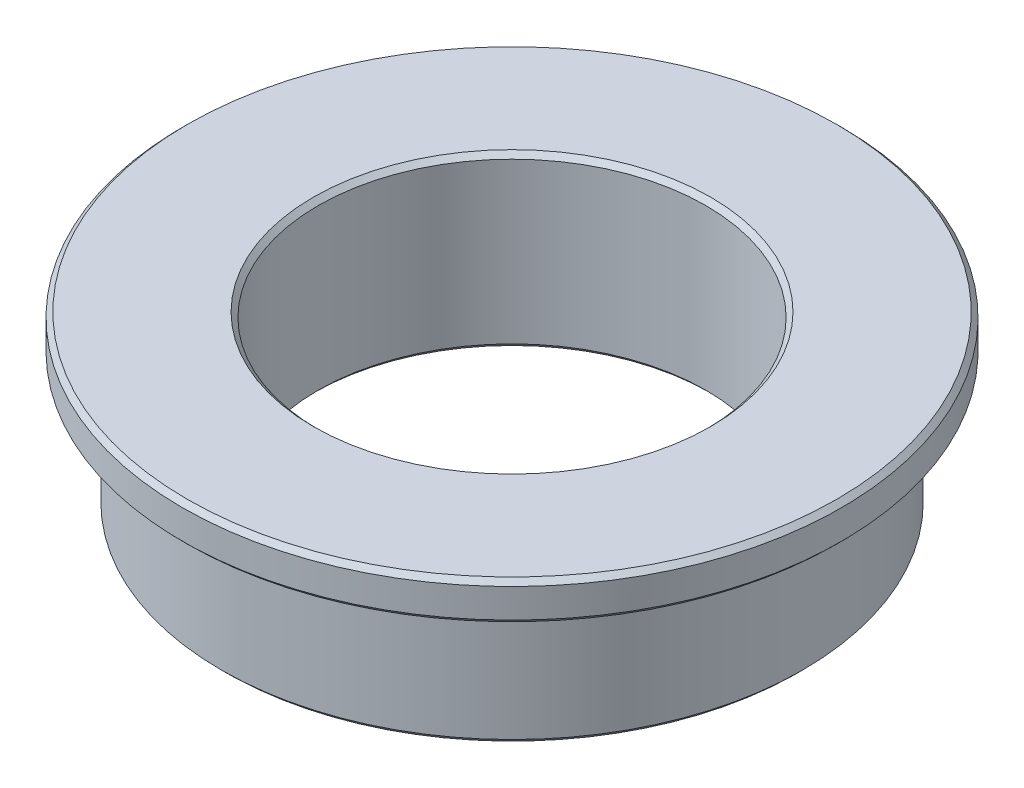
ISO-10303-21;
HEADER;
FILE_DESCRIPTION(('STEP AP214'),'2;1');
FILE_NAME('part.step','',(''),(''),'','','');
FILE_SCHEMA(('AUTOMOTIVE_DESIGN { 1 0 10303 214 1 1 1 1 }'));
ENDSEC;
DATA;
#1=APPLICATION_CONTEXT('core data for automotive mechanical design processes');
#2=APPLICATION_PROTOCOL_DEFINITION('international standard','automotive_design',2000,#1);
#3=PRODUCT_CONTEXT('',#1,'mechanical');
#4=PRODUCT('Part','Part','',(#3));
#5=PRODUCT_RELATED_PRODUCT_CATEGORY('part','',(#4));
#6=PRODUCT_DEFINITION_FORMATION('','',#4);
#7=PRODUCT_DEFINITION_CONTEXT('part definition',#1,'design');
#8=PRODUCT_DEFINITION('design','',#6,#7);
#9=PRODUCT_DEFINITION_SHAPE('','',#8);
#10=(LENGTH_UNIT() NAMED_UNIT(*) SI_UNIT(.MILLI.,.METRE.));
#11=(NAMED_UNIT(*) PLANE_ANGLE_UNIT() SI_UNIT($,.RADIAN.));
#12=(NAMED_UNIT(*) SI_UNIT($,.STERADIAN.) SOLID_ANGLE_UNIT());
#13=UNCERTAINTY_MEASURE_WITH_UNIT(LENGTH_MEASURE(1.E-05),#10,'distance_accuracy_value','');
#14=(GEOMETRIC_REPRESENTATION_CONTEXT(3) GLOBAL_UNCERTAINTY_ASSIGNED_CONTEXT((#13)) GLOBAL_UNIT_ASSIGNED_CONTEXT((#10,
#11,#12)) REPRESENTATION_CONTEXT('',''));
#15=CARTESIAN_POINT('',(0.,0.,0.));
#16=DIRECTION('',(0.,0.,1.));
#17=DIRECTION('',(1.,0.,0.));
#18=AXIS2_PLACEMENT_3D('',#15,#16,#17);
#19=CARTESIAN_POINT('',(4.,0.,0.));
#20=DIRECTION('',(0.,-1.,0.));
#21=DIRECTION('',(0.,0.,-1.));
#22=AXIS2_PLACEMENT_3D('',#19,#20,#21);
#23=PLANE('',#22);
#24=CARTESIAN_POINT('',(0.,0.,0.));
#25=DIRECTION('',(0.,-1.,0.));
#26=DIRECTION('',(0.,0.,-1.));
#27=AXIS2_PLACEMENT_3D('',#24,#25,#26);
#28=CIRCLE('',#27,5.9);
#29=CARTESIAN_POINT('',(0.,0.,-5.9));
#30=VERTEX_POINT('',#29);
#31=EDGE_CURVE('E72',#30,#30,#28,.T.);
#32=ORIENTED_EDGE('',*,*,#31,.T.);
#33=EDGE_LOOP('',(#32));
#34=FACE_BOUND('',#33,.T.);
#35=CARTESIAN_POINT('',(0.,0.,0.));
#36=DIRECTION('',(0.,-1.,0.));
#37=DIRECTION('',(0.,0.,-1.));
#38=AXIS2_PLACEMENT_3D('',#35,#36,#37);
#39=CIRCLE('',#38,4.1);
#40=CARTESIAN_POINT('',(0.,0.,-4.1));
#41=VERTEX_POINT('',#40);
#42=EDGE_CURVE('E75',#41,#41,#39,.F.);
#43=ORIENTED_EDGE('',*,*,#42,.T.);
#44=EDGE_LOOP('',(#43));
#45=FACE_BOUND('',#44,.T.);
#46=ADVANCED_FACE('F39',(#34,#45),#23,.T.);
#47=CARTESIAN_POINT('',(0.,0.,0.));
#48=DIRECTION('',(0.,-1.,0.));
#49=DIRECTION('',(0.,0.,-1.));
#50=AXIS2_PLACEMENT_3D('',#47,#48,#49);
#51=CYLINDRICAL_SURFACE('',#50,6.);
#52=CARTESIAN_POINT('',(0.,0.1,0.));
#53=DIRECTION('',(0.,-1.,0.));
#54=DIRECTION('',(0.,0.,-1.));
#55=AXIS2_PLACEMENT_3D('',#52,#53,#54);
#56=CIRCLE('',#55,6.);
#57=CARTESIAN_POINT('',(0.,0.1,-6.));
#58=VERTEX_POINT('',#57);
#59=EDGE_CURVE('E69',#58,#58,#56,.F.);
#60=ORIENTED_EDGE('',*,*,#59,.T.);
#61=EDGE_LOOP('',(#60));
#62=FACE_BOUND('',#61,.T.);
#63=CARTESIAN_POINT('',(0.,2.7,0.));
#64=DIRECTION('',(0.,-1.,0.));
#65=DIRECTION('',(0.,0.,-1.));
#66=AXIS2_PLACEMENT_3D('',#63,#64,#65);
#67=CIRCLE('',#66,6.);
#68=CARTESIAN_POINT('',(0.,2.7,-6.));
#69=VERTEX_POINT('',#68);
#70=EDGE_CURVE('E78',#69,#69,#67,.T.);
#71=ORIENTED_EDGE('',*,*,#70,.T.);
#72=EDGE_LOOP('',(#71));
#73=FACE_BOUND('',#72,.T.);
#74=ADVANCED_FACE('F82',(#62,#73),#51,.T.);
#75=CARTESIAN_POINT('',(6.,2.7,0.));
#76=DIRECTION('',(0.,-1.,0.));
#77=DIRECTION('',(0.,0.,-1.));
#78=AXIS2_PLACEMENT_3D('',#75,#76,#77);
#79=PLANE('',#78);
#80=CARTESIAN_POINT('',(0.,2.7,0.));
#81=DIRECTION('',(0.,-1.,0.));
#82=DIRECTION('',(0.,0.,-1.));
#83=AXIS2_PLACEMENT_3D('',#80,#81,#82);
#84=CIRCLE('',#83,6.7);
#85=CARTESIAN_POINT('',(0.,2.7,-6.7));
#86=VERTEX_POINT('',#85);
#87=EDGE_CURVE('E60',#86,#86,#84,.T.);
#88=ORIENTED_EDGE('',*,*,#87,.T.);
#89=EDGE_LOOP('',(#88));
#90=FACE_BOUND('',#89,.T.);
#91=ORIENTED_EDGE('',*,*,#70,.F.);
#92=EDGE_LOOP('',(#91));
#93=FACE_BOUND('',#92,.T.);
#94=ADVANCED_FACE('F84',(#90,#93),#79,.T.);
#95=CARTESIAN_POINT('',(0.,0.,0.));
#96=DIRECTION('',(0.,-1.,0.));
#97=DIRECTION('',(0.,0.,-1.));
#98=AXIS2_PLACEMENT_3D('',#95,#96,#97);
#99=CYLINDRICAL_SURFACE('',#98,6.8);
#100=CARTESIAN_POINT('',(0.,2.8,0.));
#101=DIRECTION('',(0.,-1.,0.));
#102=DIRECTION('',(0.,0.,-1.));
#103=AXIS2_PLACEMENT_3D('',#100,#101,#102);
#104=CIRCLE('',#103,6.8);
#105=CARTESIAN_POINT('',(0.,2.8,-6.8));
#106=VERTEX_POINT('',#105);
#107=EDGE_CURVE('E51',#106,#106,#104,.F.);
#108=ORIENTED_EDGE('',*,*,#107,.T.);
#109=EDGE_LOOP('',(#108));
#110=FACE_BOUND('',#109,.T.);
#111=CARTESIAN_POINT('',(0.,3.4,0.));
#112=DIRECTION('',(0.,1.,0.));
#113=DIRECTION('',(0.,0.,1.));
#114=AXIS2_PLACEMENT_3D('',#111,#112,#113);
#115=CIRCLE('',#114,6.8);
#116=CARTESIAN_POINT('',(0.,3.4,6.8));
#117=VERTEX_POINT('',#116);
#118=EDGE_CURVE('E55',#117,#117,#115,.F.);
#119=ORIENTED_EDGE('',*,*,#118,.T.);
#120=EDGE_LOOP('',(#119));
#121=FACE_BOUND('',#120,.T.);
#122=ADVANCED_FACE('F86',(#110,#121),#99,.T.);
#123=CARTESIAN_POINT('',(6.8,3.5,0.));
#124=DIRECTION('',(0.,1.,0.));
#125=DIRECTION('',(0.,0.,1.));
#126=AXIS2_PLACEMENT_3D('',#123,#124,#125);
#127=PLANE('',#126);
#128=CARTESIAN_POINT('',(0.,3.5,0.));
#129=DIRECTION('',(0.,1.,0.));
#130=DIRECTION('',(0.,0.,1.));
#131=AXIS2_PLACEMENT_3D('',#128,#129,#130);
#132=CIRCLE('',#131,6.7);
#133=CARTESIAN_POINT('',(0.,3.5,6.7));
#134=VERTEX_POINT('',#133);
#135=EDGE_CURVE('E10',#134,#134,#132,.T.);
#136=ORIENTED_EDGE('',*,*,#135,.T.);
#137=EDGE_LOOP('',(#136));
#138=FACE_BOUND('',#137,.T.);
#139=CARTESIAN_POINT('',(0.,3.5,0.));
#140=DIRECTION('',(0.,1.,0.));
#141=DIRECTION('',(0.,0.,1.));
#142=AXIS2_PLACEMENT_3D('',#139,#140,#141);
#143=CIRCLE('',#142,4.1);
#144=CARTESIAN_POINT('',(0.,3.5,4.1));
#145=VERTEX_POINT('',#144);
#146=EDGE_CURVE('E47',#145,#145,#143,.F.);
#147=ORIENTED_EDGE('',*,*,#146,.T.);
#148=EDGE_LOOP('',(#147));
#149=FACE_BOUND('',#148,.T.);
#150=ADVANCED_FACE('F93',(#138,#149),#127,.T.);
#151=CARTESIAN_POINT('',(0.,0.,0.));
#152=DIRECTION('',(0.,-1.,0.));
#153=DIRECTION('',(0.,0.,-1.));
#154=AXIS2_PLACEMENT_3D('',#151,#152,#153);
#155=CYLINDRICAL_SURFACE('',#154,4.);
#156=CARTESIAN_POINT('',(0.,0.100000000000002,0.));
#157=DIRECTION('',(0.,-1.,0.));
#158=DIRECTION('',(0.,0.,-1.));
#159=AXIS2_PLACEMENT_3D('',#156,#157,#158);
#160=CIRCLE('',#159,4.);
#161=CARTESIAN_POINT('',(0.,0.100000000000002,-4.));
#162=VERTEX_POINT('',#161);
#163=EDGE_CURVE('E63',#162,#162,#160,.T.);
#164=ORIENTED_EDGE('',*,*,#163,.T.);
#165=EDGE_LOOP('',(#164));
#166=FACE_BOUND('',#165,.T.);
#167=CARTESIAN_POINT('',(0.,3.4,0.));
#168=DIRECTION('',(0.,1.,0.));
#169=DIRECTION('',(0.,0.,1.));
#170=AXIS2_PLACEMENT_3D('',#167,#168,#169);
#171=CIRCLE('',#170,4.);
#172=CARTESIAN_POINT('',(0.,3.4,4.));
#173=VERTEX_POINT('',#172);
#174=EDGE_CURVE('E66',#173,#173,#171,.T.);
#175=ORIENTED_EDGE('',*,*,#174,.T.);
#176=EDGE_LOOP('',(#175));
#177=FACE_BOUND('',#176,.T.);
#178=ADVANCED_FACE('F113',(#166,#177),#155,.F.);
#179=CARTESIAN_POINT('',(0.,0.,0.));
#180=DIRECTION('',(0.,1.,0.));
#181=DIRECTION('',(0.,0.,1.));
#182=AXIS2_PLACEMENT_3D('',#179,#180,#181);
#183=CONICAL_SURFACE('',#182,5.9,0.785398163397435);
#184=ORIENTED_EDGE('',*,*,#59,.F.);
#185=EDGE_LOOP('',(#184));
#186=FACE_BOUND('',#185,.T.);
#187=ORIENTED_EDGE('',*,*,#31,.F.);
#188=EDGE_LOOP('',(#187));
#189=FACE_BOUND('',#188,.T.);
#190=ADVANCED_FACE('F106',(#186,#189),#183,.T.);
#191=CARTESIAN_POINT('',(0.,0.100000000000002,0.));
#192=DIRECTION('',(0.,-1.,0.));
#193=DIRECTION('',(0.,0.,-1.));
#194=AXIS2_PLACEMENT_3D('',#191,#192,#193);
#195=CONICAL_SURFACE('',#194,4.,0.785398163397448);
#196=ORIENTED_EDGE('',*,*,#42,.F.);
#197=EDGE_LOOP('',(#196));
#198=FACE_BOUND('',#197,.T.);
#199=ORIENTED_EDGE('',*,*,#163,.F.);
#200=EDGE_LOOP('',(#199));
#201=FACE_BOUND('',#200,.T.);
#202=ADVANCED_FACE('F112',(#198,#201),#195,.F.);
#203=CARTESIAN_POINT('',(0.,2.7,0.));
#204=DIRECTION('',(0.,1.,0.));
#205=DIRECTION('',(0.,0.,1.));
#206=AXIS2_PLACEMENT_3D('',#203,#204,#205);
#207=CONICAL_SURFACE('',#206,6.7,0.785398163397453);
#208=ORIENTED_EDGE('',*,*,#107,.F.);
#209=EDGE_LOOP('',(#208));
#210=FACE_BOUND('',#209,.T.);
#211=ORIENTED_EDGE('',*,*,#87,.F.);
#212=EDGE_LOOP('',(#211));
#213=FACE_BOUND('',#212,.T.);
#214=ADVANCED_FACE('F120',(#210,#213),#207,.T.);
#215=CARTESIAN_POINT('',(0.,3.4,0.));
#216=DIRECTION('',(0.,-1.,0.));
#217=DIRECTION('',(0.,0.,-1.));
#218=AXIS2_PLACEMENT_3D('',#215,#216,#217);
#219=CONICAL_SURFACE('',#218,6.8,0.785398163397448);
#220=ORIENTED_EDGE('',*,*,#135,.F.);
#221=EDGE_LOOP('',(#220));
#222=FACE_BOUND('',#221,.T.);
#223=ORIENTED_EDGE('',*,*,#118,.F.);
#224=EDGE_LOOP('',(#223));
#225=FACE_BOUND('',#224,.T.);
#226=ADVANCED_FACE('F126',(#222,#225),#219,.T.);
#227=CARTESIAN_POINT('',(0.,3.5,0.));
#228=DIRECTION('',(0.,1.,0.));
#229=DIRECTION('',(0.,0.,1.));
#230=AXIS2_PLACEMENT_3D('',#227,#228,#229);
#231=CONICAL_SURFACE('',#230,4.1,0.78539816339744);
#232=ORIENTED_EDGE('',*,*,#174,.F.);
#233=EDGE_LOOP('',(#232));
#234=FACE_BOUND('',#233,.T.);
#235=ORIENTED_EDGE('',*,*,#146,.F.);
#236=EDGE_LOOP('',(#235));
#237=FACE_BOUND('',#236,.T.);
#238=ADVANCED_FACE('F42',(#234,#237),#231,.F.);
#239=CLOSED_SHELL('',(#46,#74,#94,#122,#150,#178,#190,#202,#214,#226,#238));
#240=MANIFOLD_SOLID_BREP('B2',#239);
#241=ADVANCED_BREP_SHAPE_REPRESENTATION('',(#18,#240),#14);
#242=SHAPE_DEFINITION_REPRESENTATION(#9,#241);
ENDSEC;
END-ISO-10303-21;
